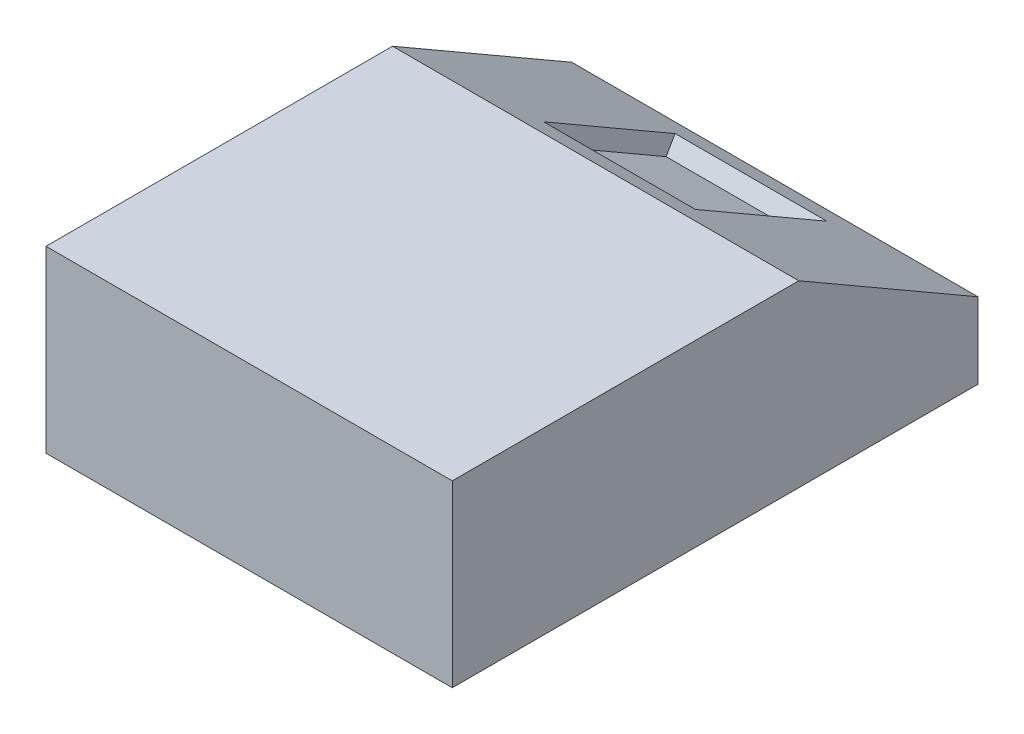
ISO-10303-21;
HEADER;
FILE_DESCRIPTION(('STEP AP214'),'2;1');
FILE_NAME('part.step','',(''),(''),'','','');
FILE_SCHEMA(('AUTOMOTIVE_DESIGN { 1 0 10303 214 1 1 1 1 }'));
ENDSEC;
DATA;
#1=APPLICATION_CONTEXT('core data for automotive mechanical design processes');
#2=APPLICATION_PROTOCOL_DEFINITION('international standard','automotive_design',2000,#1);
#3=PRODUCT_CONTEXT('',#1,'mechanical');
#4=PRODUCT('Part','Part','',(#3));
#5=PRODUCT_RELATED_PRODUCT_CATEGORY('part','',(#4));
#6=PRODUCT_DEFINITION_FORMATION('','',#4);
#7=PRODUCT_DEFINITION_CONTEXT('part definition',#1,'design');
#8=PRODUCT_DEFINITION('design','',#6,#7);
#9=PRODUCT_DEFINITION_SHAPE('','',#8);
#10=(LENGTH_UNIT() NAMED_UNIT(*) SI_UNIT(.MILLI.,.METRE.));
#11=(NAMED_UNIT(*) PLANE_ANGLE_UNIT() SI_UNIT($,.RADIAN.));
#12=(NAMED_UNIT(*) SI_UNIT($,.STERADIAN.) SOLID_ANGLE_UNIT());
#13=UNCERTAINTY_MEASURE_WITH_UNIT(LENGTH_MEASURE(1.E-05),#10,'distance_accuracy_value','');
#14=(GEOMETRIC_REPRESENTATION_CONTEXT(3) GLOBAL_UNCERTAINTY_ASSIGNED_CONTEXT((#13)) GLOBAL_UNIT_ASSIGNED_CONTEXT((#10,
#11,#12)) REPRESENTATION_CONTEXT('',''));
#15=CARTESIAN_POINT('',(0.,0.,0.));
#16=DIRECTION('',(0.,0.,1.));
#17=DIRECTION('',(1.,0.,0.));
#18=AXIS2_PLACEMENT_3D('',#15,#16,#17);
#19=CARTESIAN_POINT('',(0.,0.,0.));
#20=DIRECTION('',(0.,1.,0.));
#21=DIRECTION('',(0.,0.,1.));
#22=AXIS2_PLACEMENT_3D('',#19,#20,#21);
#23=PLANE('',#22);
#24=DIRECTION('',(0.,0.,1.));
#25=VECTOR('',#24,1.);
#26=CARTESIAN_POINT('',(34.,0.,0.));
#27=LINE('',#26,#25);
#28=CARTESIAN_POINT('',(34.,0.,-44.));
#29=VERTEX_POINT('',#28);
#30=CARTESIAN_POINT('',(34.,0.,44.));
#31=VERTEX_POINT('',#30);
#32=EDGE_CURVE('E194',#29,#31,#27,.T.);
#33=ORIENTED_EDGE('',*,*,#32,.T.);
#34=DIRECTION('',(1.,0.,0.));
#35=VECTOR('',#34,1.);
#36=CARTESIAN_POINT('',(0.,0.,44.));
#37=LINE('',#36,#35);
#38=CARTESIAN_POINT('',(-34.,0.,44.));
#39=VERTEX_POINT('',#38);
#40=EDGE_CURVE('E212',#39,#31,#37,.T.);
#41=ORIENTED_EDGE('',*,*,#40,.F.);
#42=DIRECTION('',(0.,0.,1.));
#43=VECTOR('',#42,1.);
#44=CARTESIAN_POINT('',(-34.,0.,0.));
#45=LINE('',#44,#43);
#46=CARTESIAN_POINT('',(-34.,0.,-44.));
#47=VERTEX_POINT('',#46);
#48=EDGE_CURVE('E223',#47,#39,#45,.T.);
#49=ORIENTED_EDGE('',*,*,#48,.F.);
#50=DIRECTION('',(1.,0.,0.));
#51=VECTOR('',#50,1.);
#52=CARTESIAN_POINT('',(0.,0.,-44.));
#53=LINE('',#52,#51);
#54=EDGE_CURVE('E220',#47,#29,#53,.T.);
#55=ORIENTED_EDGE('',*,*,#54,.T.);
#56=EDGE_LOOP('',(#33,#41,#49,#55));
#57=FACE_BOUND('',#56,.T.);
#58=DIRECTION('',(0.,0.,1.));
#59=VECTOR('',#58,1.);
#60=CARTESIAN_POINT('',(31.,0.,0.));
#61=LINE('',#60,#59);
#62=CARTESIAN_POINT('',(31.,0.,-41.));
#63=VERTEX_POINT('',#62);
#64=CARTESIAN_POINT('',(31.,0.,41.));
#65=VERTEX_POINT('',#64);
#66=EDGE_CURVE('E149',#63,#65,#61,.T.);
#67=ORIENTED_EDGE('',*,*,#66,.F.);
#68=DIRECTION('',(1.,0.,0.));
#69=VECTOR('',#68,1.);
#70=CARTESIAN_POINT('',(0.,0.,-41.));
#71=LINE('',#70,#69);
#72=CARTESIAN_POINT('',(-31.,0.,-41.));
#73=VERTEX_POINT('',#72);
#74=EDGE_CURVE('E201',#73,#63,#71,.T.);
#75=ORIENTED_EDGE('',*,*,#74,.F.);
#76=DIRECTION('',(0.,0.,1.));
#77=VECTOR('',#76,1.);
#78=CARTESIAN_POINT('',(-31.,0.,0.));
#79=LINE('',#78,#77);
#80=CARTESIAN_POINT('',(-31.,0.,41.));
#81=VERTEX_POINT('',#80);
#82=EDGE_CURVE('E204',#73,#81,#79,.T.);
#83=ORIENTED_EDGE('',*,*,#82,.T.);
#84=DIRECTION('',(1.,0.,0.));
#85=VECTOR('',#84,1.);
#86=CARTESIAN_POINT('',(0.,0.,41.));
#87=LINE('',#86,#85);
#88=EDGE_CURVE('E182',#81,#65,#87,.T.);
#89=ORIENTED_EDGE('',*,*,#88,.T.);
#90=EDGE_LOOP('',(#67,#75,#83,#89));
#91=FACE_BOUND('',#90,.T.);
#92=ADVANCED_FACE('F34',(#57,#91),#23,.F.);
#93=CARTESIAN_POINT('',(34.,30.,0.));
#94=DIRECTION('',(1.,0.,0.));
#95=DIRECTION('',(0.,0.,-1.));
#96=AXIS2_PLACEMENT_3D('',#93,#94,#95);
#97=PLANE('',#96);
#98=DIRECTION('',(0.,-1.,0.));
#99=VECTOR('',#98,1.);
#100=CARTESIAN_POINT('',(34.,30.,-44.));
#101=LINE('',#100,#99);
#102=CARTESIAN_POINT('',(34.,12.6794919243112,-44.));
#103=VERTEX_POINT('',#102);
#104=EDGE_CURVE('E233',#103,#29,#101,.T.);
#105=ORIENTED_EDGE('',*,*,#104,.F.);
#106=DIRECTION('',(0.,-0.499999999999998,-0.86602540378444));
#107=VECTOR('',#106,1.);
#108=CARTESIAN_POINT('',(34.,36.062177826491,-3.49999999999993));
#109=LINE('',#108,#107);
#110=CARTESIAN_POINT('',(34.,30.,-13.9999999999998));
#111=VERTEX_POINT('',#110);
#112=EDGE_CURVE('E238',#103,#111,#109,.F.);
#113=ORIENTED_EDGE('',*,*,#112,.T.);
#114=DIRECTION('',(0.,0.,1.));
#115=VECTOR('',#114,1.);
#116=CARTESIAN_POINT('',(34.,30.,0.));
#117=LINE('',#116,#115);
#118=CARTESIAN_POINT('',(34.,30.,44.));
#119=VERTEX_POINT('',#118);
#120=EDGE_CURVE('E209',#111,#119,#117,.T.);
#121=ORIENTED_EDGE('',*,*,#120,.T.);
#122=DIRECTION('',(0.,-1.,0.));
#123=VECTOR('',#122,1.);
#124=CARTESIAN_POINT('',(34.,30.,44.));
#125=LINE('',#124,#123);
#126=EDGE_CURVE('E217',#119,#31,#125,.T.);
#127=ORIENTED_EDGE('',*,*,#126,.T.);
#128=ORIENTED_EDGE('',*,*,#32,.F.);
#129=EDGE_LOOP('',(#105,#113,#121,#127,#128));
#130=FACE_BOUND('',#129,.T.);
#131=ADVANCED_FACE('F258',(#130),#97,.T.);
#132=CARTESIAN_POINT('',(0.,30.,-44.));
#133=DIRECTION('',(0.,0.,-1.));
#134=DIRECTION('',(-1.,0.,0.));
#135=AXIS2_PLACEMENT_3D('',#132,#133,#134);
#136=PLANE('',#135);
#137=DIRECTION('',(0.,-1.,0.));
#138=VECTOR('',#137,1.);
#139=CARTESIAN_POINT('',(-34.,30.,-44.));
#140=LINE('',#139,#138);
#141=CARTESIAN_POINT('',(-34.,12.6794919243112,-44.));
#142=VERTEX_POINT('',#141);
#143=EDGE_CURVE('E231',#142,#47,#140,.T.);
#144=ORIENTED_EDGE('',*,*,#143,.F.);
#145=DIRECTION('',(1.,0.,0.));
#146=VECTOR('',#145,1.);
#147=CARTESIAN_POINT('',(0.,12.6794919243112,-44.));
#148=LINE('',#147,#146);
#149=EDGE_CURVE('E235',#142,#103,#148,.T.);
#150=ORIENTED_EDGE('',*,*,#149,.T.);
#151=ORIENTED_EDGE('',*,*,#104,.T.);
#152=ORIENTED_EDGE('',*,*,#54,.F.);
#153=EDGE_LOOP('',(#144,#150,#151,#152));
#154=FACE_BOUND('',#153,.T.);
#155=ADVANCED_FACE('F254',(#154),#136,.T.);
#156=CARTESIAN_POINT('',(-34.,30.,0.));
#157=DIRECTION('',(1.,0.,0.));
#158=DIRECTION('',(0.,0.,-1.));
#159=AXIS2_PLACEMENT_3D('',#156,#157,#158);
#160=PLANE('',#159);
#161=DIRECTION('',(0.,0.,1.));
#162=VECTOR('',#161,1.);
#163=CARTESIAN_POINT('',(-34.,30.,0.));
#164=LINE('',#163,#162);
#165=CARTESIAN_POINT('',(-34.,30.,-13.9999999999998));
#166=VERTEX_POINT('',#165);
#167=CARTESIAN_POINT('',(-34.,30.,44.));
#168=VERTEX_POINT('',#167);
#169=EDGE_CURVE('E211',#166,#168,#164,.T.);
#170=ORIENTED_EDGE('',*,*,#169,.F.);
#171=DIRECTION('',(0.,0.499999999999998,0.86602540378444));
#172=VECTOR('',#171,1.);
#173=CARTESIAN_POINT('',(-34.,12.6794919243112,-44.));
#174=LINE('',#173,#172);
#175=EDGE_CURVE('E11',#166,#142,#174,.F.);
#176=ORIENTED_EDGE('',*,*,#175,.T.);
#177=ORIENTED_EDGE('',*,*,#143,.T.);
#178=ORIENTED_EDGE('',*,*,#48,.T.);
#179=DIRECTION('',(0.,-1.,0.));
#180=VECTOR('',#179,1.);
#181=CARTESIAN_POINT('',(-34.,30.,44.));
#182=LINE('',#181,#180);
#183=EDGE_CURVE('E228',#168,#39,#182,.T.);
#184=ORIENTED_EDGE('',*,*,#183,.F.);
#185=EDGE_LOOP('',(#170,#176,#177,#178,#184));
#186=FACE_BOUND('',#185,.T.);
#187=ADVANCED_FACE('F248',(#186),#160,.F.);
#188=CARTESIAN_POINT('',(0.,30.,44.));
#189=DIRECTION('',(0.,0.,-1.));
#190=DIRECTION('',(-1.,0.,0.));
#191=AXIS2_PLACEMENT_3D('',#188,#189,#190);
#192=PLANE('',#191);
#193=ORIENTED_EDGE('',*,*,#40,.T.);
#194=ORIENTED_EDGE('',*,*,#126,.F.);
#195=DIRECTION('',(1.,0.,0.));
#196=VECTOR('',#195,1.);
#197=CARTESIAN_POINT('',(0.,30.,44.));
#198=LINE('',#197,#196);
#199=EDGE_CURVE('E214',#168,#119,#198,.T.);
#200=ORIENTED_EDGE('',*,*,#199,.F.);
#201=ORIENTED_EDGE('',*,*,#183,.T.);
#202=EDGE_LOOP('',(#193,#194,#200,#201));
#203=FACE_BOUND('',#202,.T.);
#204=ADVANCED_FACE('F265',(#203),#192,.F.);
#205=CARTESIAN_POINT('',(0.,30.,0.));
#206=DIRECTION('',(0.,1.,0.));
#207=DIRECTION('',(0.,0.,1.));
#208=AXIS2_PLACEMENT_3D('',#205,#206,#207);
#209=PLANE('',#208);
#210=ORIENTED_EDGE('',*,*,#120,.F.);
#211=DIRECTION('',(-1.,0.,0.));
#212=VECTOR('',#211,1.);
#213=CARTESIAN_POINT('',(0.,30.,-13.9999999999998));
#214=LINE('',#213,#212);
#215=EDGE_CURVE('E43',#111,#166,#214,.T.);
#216=ORIENTED_EDGE('',*,*,#215,.T.);
#217=ORIENTED_EDGE('',*,*,#169,.T.);
#218=ORIENTED_EDGE('',*,*,#199,.T.);
#219=EDGE_LOOP('',(#210,#216,#217,#218));
#220=FACE_BOUND('',#219,.T.);
#221=ADVANCED_FACE('F243',(#220),#209,.T.);
#222=CARTESIAN_POINT('',(0.,12.6794919243112,-44.));
#223=DIRECTION('',(0.,-0.86602540378444,0.499999999999998));
#224=DIRECTION('',(1.,0.,0.));
#225=AXIS2_PLACEMENT_3D('',#222,#223,#224);
#226=PLANE('',#225);
#227=DIRECTION('',(0.,-0.499999999999998,-0.86602540378444));
#228=VECTOR('',#227,1.);
#229=CARTESIAN_POINT('',(12.7,14.9897459621556,-39.9985226280623));
#230=LINE('',#229,#228);
#231=CARTESIAN_POINT('',(12.7,27.6897459621556,-18.0014773719375));
#232=VERTEX_POINT('',#231);
#233=CARTESIAN_POINT('',(12.7,14.9897459621556,-39.9985226280623));
#234=VERTEX_POINT('',#233);
#235=EDGE_CURVE('E50',#232,#234,#230,.T.);
#236=ORIENTED_EDGE('',*,*,#235,.F.);
#237=DIRECTION('',(1.,0.,0.));
#238=VECTOR('',#237,1.);
#239=CARTESIAN_POINT('',(-12.7,27.6897459621556,-18.0014773719375));
#240=LINE('',#239,#238);
#241=CARTESIAN_POINT('',(-12.7,27.6897459621556,-18.0014773719375));
#242=VERTEX_POINT('',#241);
#243=EDGE_CURVE('E143',#242,#232,#240,.T.);
#244=ORIENTED_EDGE('',*,*,#243,.F.);
#245=DIRECTION('',(0.,0.499999999999998,0.86602540378444));
#246=VECTOR('',#245,1.);
#247=CARTESIAN_POINT('',(-12.7,14.9897459621556,-39.9985226280623));
#248=LINE('',#247,#246);
#249=CARTESIAN_POINT('',(-12.7,14.9897459621556,-39.9985226280623));
#250=VERTEX_POINT('',#249);
#251=EDGE_CURVE('E163',#250,#242,#248,.T.);
#252=ORIENTED_EDGE('',*,*,#251,.F.);
#253=DIRECTION('',(-1.,0.,0.));
#254=VECTOR('',#253,1.);
#255=CARTESIAN_POINT('',(-12.7,14.9897459621556,-39.9985226280623));
#256=LINE('',#255,#254);
#257=EDGE_CURVE('E157',#234,#250,#256,.T.);
#258=ORIENTED_EDGE('',*,*,#257,.F.);
#259=EDGE_LOOP('',(#236,#244,#252,#258));
#260=FACE_BOUND('',#259,.T.);
#261=ORIENTED_EDGE('',*,*,#175,.F.);
#262=ORIENTED_EDGE('',*,*,#215,.F.);
#263=ORIENTED_EDGE('',*,*,#112,.F.);
#264=ORIENTED_EDGE('',*,*,#149,.F.);
#265=EDGE_LOOP('',(#261,#262,#263,#264));
#266=FACE_BOUND('',#265,.T.);
#267=ADVANCED_FACE('F37',(#260,#266),#226,.F.);
#268=CARTESIAN_POINT('',(31.,30.,0.));
#269=DIRECTION('',(1.,0.,0.));
#270=DIRECTION('',(0.,0.,-1.));
#271=AXIS2_PLACEMENT_3D('',#268,#269,#270);
#272=PLANE('',#271);
#273=DIRECTION('',(0.,-1.,0.));
#274=VECTOR('',#273,1.);
#275=CARTESIAN_POINT('',(31.,30.,-41.));
#276=LINE('',#275,#274);
#277=CARTESIAN_POINT('',(31.,10.9474411167423,-41.));
#278=VERTEX_POINT('',#277);
#279=EDGE_CURVE('E172',#278,#63,#276,.T.);
#280=ORIENTED_EDGE('',*,*,#279,.T.);
#281=ORIENTED_EDGE('',*,*,#66,.T.);
#282=DIRECTION('',(0.,-1.,0.));
#283=VECTOR('',#282,1.);
#284=CARTESIAN_POINT('',(31.,30.,41.));
#285=LINE('',#284,#283);
#286=CARTESIAN_POINT('',(31.,27.,41.));
#287=VERTEX_POINT('',#286);
#288=EDGE_CURVE('E183',#287,#65,#285,.T.);
#289=ORIENTED_EDGE('',*,*,#288,.F.);
#290=DIRECTION('',(0.,0.,1.));
#291=VECTOR('',#290,1.);
#292=CARTESIAN_POINT('',(31.,27.,0.));
#293=LINE('',#292,#291);
#294=CARTESIAN_POINT('',(31.,27.,-13.1961524227065));
#295=VERTEX_POINT('',#294);
#296=EDGE_CURVE('E179',#295,#287,#293,.T.);
#297=ORIENTED_EDGE('',*,*,#296,.F.);
#298=DIRECTION('',(0.,-0.499999999999998,-0.86602540378444));
#299=VECTOR('',#298,1.);
#300=CARTESIAN_POINT('',(31.,33.4641016151377,-1.99999999999993));
#301=LINE('',#300,#299);
#302=EDGE_CURVE('E176',#278,#295,#301,.F.);
#303=ORIENTED_EDGE('',*,*,#302,.F.);
#304=EDGE_LOOP('',(#280,#281,#289,#297,#303));
#305=FACE_BOUND('',#304,.T.);
#306=ADVANCED_FACE('F297',(#305),#272,.F.);
#307=CARTESIAN_POINT('',(0.,30.,-41.));
#308=DIRECTION('',(0.,0.,-1.));
#309=DIRECTION('',(-1.,0.,0.));
#310=AXIS2_PLACEMENT_3D('',#307,#308,#309);
#311=PLANE('',#310);
#312=DIRECTION('',(0.,-1.,0.));
#313=VECTOR('',#312,1.);
#314=CARTESIAN_POINT('',(-31.,30.,-41.));
#315=LINE('',#314,#313);
#316=CARTESIAN_POINT('',(-31.,10.9474411167423,-41.));
#317=VERTEX_POINT('',#316);
#318=EDGE_CURVE('E175',#317,#73,#315,.T.);
#319=ORIENTED_EDGE('',*,*,#318,.T.);
#320=ORIENTED_EDGE('',*,*,#74,.T.);
#321=ORIENTED_EDGE('',*,*,#279,.F.);
#322=DIRECTION('',(-1.,0.,0.));
#323=VECTOR('',#322,1.);
#324=CARTESIAN_POINT('',(0.,10.9474411167423,-41.));
#325=LINE('',#324,#323);
#326=EDGE_CURVE('E174',#317,#278,#325,.F.);
#327=ORIENTED_EDGE('',*,*,#326,.F.);
#328=EDGE_LOOP('',(#319,#320,#321,#327));
#329=FACE_BOUND('',#328,.T.);
#330=ADVANCED_FACE('F293',(#329),#311,.F.);
#331=CARTESIAN_POINT('',(-31.,30.,0.));
#332=DIRECTION('',(1.,0.,0.));
#333=DIRECTION('',(0.,0.,-1.));
#334=AXIS2_PLACEMENT_3D('',#331,#332,#333);
#335=PLANE('',#334);
#336=DIRECTION('',(0.,0.,1.));
#337=VECTOR('',#336,1.);
#338=CARTESIAN_POINT('',(-31.,27.,0.));
#339=LINE('',#338,#337);
#340=CARTESIAN_POINT('',(-31.,27.,-13.1961524227065));
#341=VERTEX_POINT('',#340);
#342=CARTESIAN_POINT('',(-31.,27.,41.));
#343=VERTEX_POINT('',#342);
#344=EDGE_CURVE('E181',#341,#343,#339,.T.);
#345=ORIENTED_EDGE('',*,*,#344,.T.);
#346=DIRECTION('',(0.,-1.,0.));
#347=VECTOR('',#346,1.);
#348=CARTESIAN_POINT('',(-31.,30.,41.));
#349=LINE('',#348,#347);
#350=EDGE_CURVE('E185',#343,#81,#349,.T.);
#351=ORIENTED_EDGE('',*,*,#350,.T.);
#352=ORIENTED_EDGE('',*,*,#82,.F.);
#353=ORIENTED_EDGE('',*,*,#318,.F.);
#354=DIRECTION('',(0.,0.499999999999998,0.86602540378444));
#355=VECTOR('',#354,1.);
#356=CARTESIAN_POINT('',(-31.,10.0814157129579,-42.5));
#357=LINE('',#356,#355);
#358=EDGE_CURVE('E192',#341,#317,#357,.F.);
#359=ORIENTED_EDGE('',*,*,#358,.F.);
#360=EDGE_LOOP('',(#345,#351,#352,#353,#359));
#361=FACE_BOUND('',#360,.T.);
#362=ADVANCED_FACE('F289',(#361),#335,.T.);
#363=CARTESIAN_POINT('',(0.,30.,41.));
#364=DIRECTION('',(0.,0.,-1.));
#365=DIRECTION('',(-1.,0.,0.));
#366=AXIS2_PLACEMENT_3D('',#363,#364,#365);
#367=PLANE('',#366);
#368=ORIENTED_EDGE('',*,*,#88,.F.);
#369=ORIENTED_EDGE('',*,*,#350,.F.);
#370=DIRECTION('',(1.,0.,0.));
#371=VECTOR('',#370,1.);
#372=CARTESIAN_POINT('',(0.,27.,41.));
#373=LINE('',#372,#371);
#374=EDGE_CURVE('E186',#343,#287,#373,.T.);
#375=ORIENTED_EDGE('',*,*,#374,.T.);
#376=ORIENTED_EDGE('',*,*,#288,.T.);
#377=EDGE_LOOP('',(#368,#369,#375,#376));
#378=FACE_BOUND('',#377,.T.);
#379=ADVANCED_FACE('F285',(#378),#367,.T.);
#380=CARTESIAN_POINT('',(0.,27.,0.));
#381=DIRECTION('',(0.,1.,0.));
#382=DIRECTION('',(0.,0.,1.));
#383=AXIS2_PLACEMENT_3D('',#380,#381,#382);
#384=PLANE('',#383);
#385=ORIENTED_EDGE('',*,*,#296,.T.);
#386=ORIENTED_EDGE('',*,*,#374,.F.);
#387=ORIENTED_EDGE('',*,*,#344,.F.);
#388=DIRECTION('',(1.,0.,0.));
#389=VECTOR('',#388,1.);
#390=CARTESIAN_POINT('',(0.,27.,-13.1961524227065));
#391=LINE('',#390,#389);
#392=EDGE_CURVE('E178',#295,#341,#391,.F.);
#393=ORIENTED_EDGE('',*,*,#392,.F.);
#394=EDGE_LOOP('',(#385,#386,#387,#393));
#395=FACE_BOUND('',#394,.T.);
#396=ADVANCED_FACE('F282',(#395),#384,.F.);
#397=CARTESIAN_POINT('',(0.,10.0814157129579,-42.5));
#398=DIRECTION('',(0.,-0.86602540378444,0.499999999999998));
#399=DIRECTION('',(1.,0.,0.));
#400=AXIS2_PLACEMENT_3D('',#397,#398,#399);
#401=PLANE('',#400);
#402=DIRECTION('',(1.,0.,0.));
#403=VECTOR('',#402,1.);
#404=CARTESIAN_POINT('',(-12.7,25.0916697508023,-16.5014773719375));
#405=LINE('',#404,#403);
#406=CARTESIAN_POINT('',(12.7,25.0916697508023,-16.5014773719375));
#407=VERTEX_POINT('',#406);
#408=CARTESIAN_POINT('',(-12.7,25.0916697508023,-16.5014773719375));
#409=VERTEX_POINT('',#408);
#410=EDGE_CURVE('E155',#407,#409,#405,.F.);
#411=ORIENTED_EDGE('',*,*,#410,.F.);
#412=DIRECTION('',(0.,-0.499999999999998,-0.86602540378444));
#413=VECTOR('',#412,1.);
#414=CARTESIAN_POINT('',(12.7,12.3916697508023,-38.4985226280623));
#415=LINE('',#414,#413);
#416=CARTESIAN_POINT('',(12.7,12.3916697508023,-38.4985226280623));
#417=VERTEX_POINT('',#416);
#418=EDGE_CURVE('E137',#417,#407,#415,.F.);
#419=ORIENTED_EDGE('',*,*,#418,.F.);
#420=DIRECTION('',(-1.,0.,0.));
#421=VECTOR('',#420,1.);
#422=CARTESIAN_POINT('',(-12.7,12.3916697508023,-38.4985226280623));
#423=LINE('',#422,#421);
#424=CARTESIAN_POINT('',(-12.7,12.3916697508023,-38.4985226280623));
#425=VERTEX_POINT('',#424);
#426=EDGE_CURVE('E146',#425,#417,#423,.F.);
#427=ORIENTED_EDGE('',*,*,#426,.F.);
#428=DIRECTION('',(0.,0.499999999999998,0.86602540378444));
#429=VECTOR('',#428,1.);
#430=CARTESIAN_POINT('',(-12.7,12.3916697508023,-38.4985226280623));
#431=LINE('',#430,#429);
#432=EDGE_CURVE('E58',#409,#425,#431,.F.);
#433=ORIENTED_EDGE('',*,*,#432,.F.);
#434=EDGE_LOOP('',(#411,#419,#427,#433));
#435=FACE_BOUND('',#434,.T.);
#436=ORIENTED_EDGE('',*,*,#358,.T.);
#437=ORIENTED_EDGE('',*,*,#326,.T.);
#438=ORIENTED_EDGE('',*,*,#302,.T.);
#439=ORIENTED_EDGE('',*,*,#392,.T.);
#440=EDGE_LOOP('',(#436,#437,#438,#439));
#441=FACE_BOUND('',#440,.T.);
#442=ADVANCED_FACE('F152',(#435,#441),#401,.T.);
#443=CARTESIAN_POINT('',(12.7,-32.6261737602949,-12.507458558594));
#444=DIRECTION('',(1.,0.,0.));
#445=DIRECTION('',(0.,0.,-1.));
#446=AXIS2_PLACEMENT_3D('',#443,#444,#445);
#447=PLANE('',#446);
#448=ORIENTED_EDGE('',*,*,#418,.T.);
#449=DIRECTION('',(0.,0.86602540378444,-0.499999999999998));
#450=VECTOR('',#449,1.);
#451=CARTESIAN_POINT('',(12.7,-19.926173760295,9.48958669753077));
#452=LINE('',#451,#450);
#453=EDGE_CURVE('E150',#407,#232,#452,.T.);
#454=ORIENTED_EDGE('',*,*,#453,.T.);
#455=ORIENTED_EDGE('',*,*,#235,.T.);
#456=DIRECTION('',(0.,0.86602540378444,-0.499999999999998));
#457=VECTOR('',#456,1.);
#458=CARTESIAN_POINT('',(12.7,-32.6261737602949,-12.507458558594));
#459=LINE('',#458,#457);
#460=EDGE_CURVE('E133',#417,#234,#459,.T.);
#461=ORIENTED_EDGE('',*,*,#460,.F.);
#462=EDGE_LOOP('',(#448,#454,#455,#461));
#463=FACE_BOUND('',#462,.T.);
#464=ADVANCED_FACE('F135',(#463),#447,.F.);
#465=CARTESIAN_POINT('',(-12.7,-19.926173760295,9.48958669753077));
#466=DIRECTION('',(0.,0.499999999999998,0.86602540378444));
#467=DIRECTION('',(0.,-0.86602540378444,0.499999999999998));
#468=AXIS2_PLACEMENT_3D('',#465,#466,#467);
#469=PLANE('',#468);
#470=ORIENTED_EDGE('',*,*,#410,.T.);
#471=DIRECTION('',(0.,0.86602540378444,-0.499999999999998));
#472=VECTOR('',#471,1.);
#473=CARTESIAN_POINT('',(-12.7,-19.926173760295,9.48958669753077));
#474=LINE('',#473,#472);
#475=EDGE_CURVE('E169',#409,#242,#474,.T.);
#476=ORIENTED_EDGE('',*,*,#475,.T.);
#477=ORIENTED_EDGE('',*,*,#243,.T.);
#478=ORIENTED_EDGE('',*,*,#453,.F.);
#479=EDGE_LOOP('',(#470,#476,#477,#478));
#480=FACE_BOUND('',#479,.T.);
#481=ADVANCED_FACE('F304',(#480),#469,.F.);
#482=CARTESIAN_POINT('',(-12.7,-32.6261737602949,-12.507458558594));
#483=DIRECTION('',(-1.,0.,0.));
#484=DIRECTION('',(0.,0.,1.));
#485=AXIS2_PLACEMENT_3D('',#482,#483,#484);
#486=PLANE('',#485);
#487=ORIENTED_EDGE('',*,*,#432,.T.);
#488=DIRECTION('',(0.,0.86602540378444,-0.499999999999998));
#489=VECTOR('',#488,1.);
#490=CARTESIAN_POINT('',(-12.7,-32.6261737602949,-12.507458558594));
#491=LINE('',#490,#489);
#492=EDGE_CURVE('E142',#425,#250,#491,.T.);
#493=ORIENTED_EDGE('',*,*,#492,.T.);
#494=ORIENTED_EDGE('',*,*,#251,.T.);
#495=ORIENTED_EDGE('',*,*,#475,.F.);
#496=EDGE_LOOP('',(#487,#493,#494,#495));
#497=FACE_BOUND('',#496,.T.);
#498=ADVANCED_FACE('F307',(#497),#486,.F.);
#499=CARTESIAN_POINT('',(-12.7,-32.6261737602949,-12.507458558594));
#500=DIRECTION('',(0.,-0.499999999999998,-0.86602540378444));
#501=DIRECTION('',(0.,0.86602540378444,-0.499999999999998));
#502=AXIS2_PLACEMENT_3D('',#499,#500,#501);
#503=PLANE('',#502);
#504=ORIENTED_EDGE('',*,*,#426,.T.);
#505=ORIENTED_EDGE('',*,*,#460,.T.);
#506=ORIENTED_EDGE('',*,*,#257,.T.);
#507=ORIENTED_EDGE('',*,*,#492,.F.);
#508=EDGE_LOOP('',(#504,#505,#506,#507));
#509=FACE_BOUND('',#508,.T.);
#510=ADVANCED_FACE('F147',(#509),#503,.F.);
#511=CLOSED_SHELL('',(#92,#131,#155,#187,#204,#221,#267,#306,#330,#362,#379,#396,#442,#464,#481,
#498,#510));
#512=MANIFOLD_SOLID_BREP('B2',#511);
#513=ADVANCED_BREP_SHAPE_REPRESENTATION('',(#18,#512),#14);
#514=SHAPE_DEFINITION_REPRESENTATION(#9,#513);
ENDSEC;
END-ISO-10303-21;
